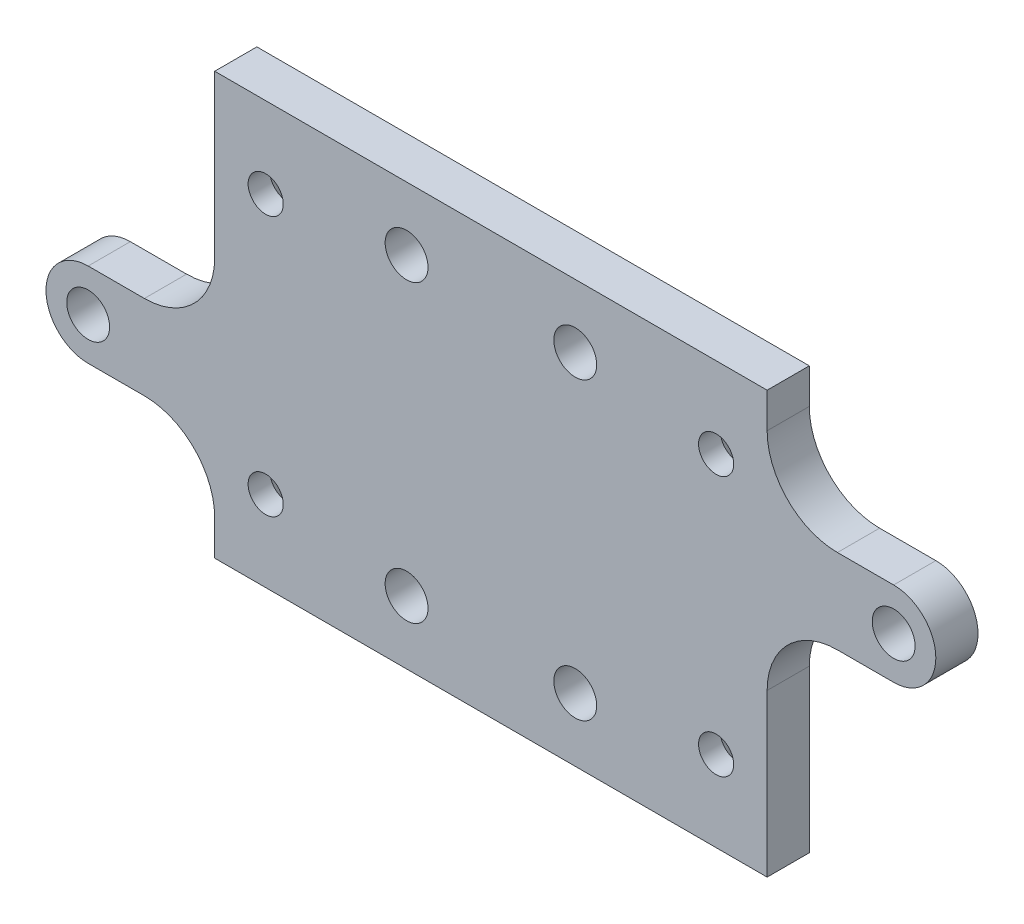
ISO-10303-21;
HEADER;
FILE_DESCRIPTION(('STEP AP214'),'2;1');
FILE_NAME('part.step','',(''),(''),'','','');
FILE_SCHEMA(('AUTOMOTIVE_DESIGN { 1 0 10303 214 1 1 1 1 }'));
ENDSEC;
DATA;
#1=APPLICATION_CONTEXT('core data for automotive mechanical design processes');
#2=APPLICATION_PROTOCOL_DEFINITION('international standard','automotive_design',2000,#1);
#3=PRODUCT_CONTEXT('',#1,'mechanical');
#4=PRODUCT('Part','Part','',(#3));
#5=PRODUCT_RELATED_PRODUCT_CATEGORY('part','',(#4));
#6=PRODUCT_DEFINITION_FORMATION('','',#4);
#7=PRODUCT_DEFINITION_CONTEXT('part definition',#1,'design');
#8=PRODUCT_DEFINITION('design','',#6,#7);
#9=PRODUCT_DEFINITION_SHAPE('','',#8);
#10=(LENGTH_UNIT() NAMED_UNIT(*) SI_UNIT(.MILLI.,.METRE.));
#11=(NAMED_UNIT(*) PLANE_ANGLE_UNIT() SI_UNIT($,.RADIAN.));
#12=(NAMED_UNIT(*) SI_UNIT($,.STERADIAN.) SOLID_ANGLE_UNIT());
#13=UNCERTAINTY_MEASURE_WITH_UNIT(LENGTH_MEASURE(1.E-05),#10,'distance_accuracy_value','');
#14=(GEOMETRIC_REPRESENTATION_CONTEXT(3) GLOBAL_UNCERTAINTY_ASSIGNED_CONTEXT((#13)) GLOBAL_UNIT_ASSIGNED_CONTEXT((#10,
#11,#12)) REPRESENTATION_CONTEXT('',''));
#15=CARTESIAN_POINT('',(0.,0.,0.));
#16=DIRECTION('',(0.,0.,1.));
#17=DIRECTION('',(1.,0.,0.));
#18=AXIS2_PLACEMENT_3D('',#15,#16,#17);
#19=CARTESIAN_POINT('',(19.65,-15.,3.));
#20=DIRECTION('',(-1.,0.,0.));
#21=DIRECTION('',(0.,0.,1.));
#22=AXIS2_PLACEMENT_3D('',#19,#20,#21);
#23=PLANE('',#22);
#24=DIRECTION('',(0.,1.,0.));
#25=VECTOR('',#24,1.);
#26=CARTESIAN_POINT('',(19.65,-15.,3.));
#27=LINE('',#26,#25);
#28=CARTESIAN_POINT('',(19.65,12.5,3.));
#29=VERTEX_POINT('',#28);
#30=CARTESIAN_POINT('',(19.65,15.,3.));
#31=VERTEX_POINT('',#30);
#32=EDGE_CURVE('E214',#29,#31,#27,.T.);
#33=ORIENTED_EDGE('',*,*,#32,.F.);
#34=DIRECTION('',(0.,0.,1.));
#35=VECTOR('',#34,1.);
#36=CARTESIAN_POINT('',(19.65,12.5,3.));
#37=LINE('',#36,#35);
#38=CARTESIAN_POINT('',(19.65,12.5,0.));
#39=VERTEX_POINT('',#38);
#40=EDGE_CURVE('E258',#29,#39,#37,.F.);
#41=ORIENTED_EDGE('',*,*,#40,.T.);
#42=DIRECTION('',(0.,1.,0.));
#43=VECTOR('',#42,1.);
#44=CARTESIAN_POINT('',(19.65,-15.,0.));
#45=LINE('',#44,#43);
#46=CARTESIAN_POINT('',(19.65,15.,0.));
#47=VERTEX_POINT('',#46);
#48=EDGE_CURVE('E199',#39,#47,#45,.T.);
#49=ORIENTED_EDGE('',*,*,#48,.T.);
#50=DIRECTION('',(0.,0.,-1.));
#51=VECTOR('',#50,1.);
#52=CARTESIAN_POINT('',(19.65,15.,3.));
#53=LINE('',#52,#51);
#54=EDGE_CURVE('E242',#31,#47,#53,.T.);
#55=ORIENTED_EDGE('',*,*,#54,.F.);
#56=EDGE_LOOP('',(#33,#41,#49,#55));
#57=FACE_BOUND('',#56,.T.);
#58=ADVANCED_FACE('F35',(#57),#23,.F.);
#59=CARTESIAN_POINT('',(-19.65,-15.,3.));
#60=DIRECTION('',(1.,0.,0.));
#61=DIRECTION('',(0.,0.,-1.));
#62=AXIS2_PLACEMENT_3D('',#59,#60,#61);
#63=PLANE('',#62);
#64=DIRECTION('',(0.,-1.,0.));
#65=VECTOR('',#64,1.);
#66=CARTESIAN_POINT('',(-19.65,-15.,3.));
#67=LINE('',#66,#65);
#68=CARTESIAN_POINT('',(-19.65,-12.5,3.));
#69=VERTEX_POINT('',#68);
#70=CARTESIAN_POINT('',(-19.65,-15.,3.));
#71=VERTEX_POINT('',#70);
#72=EDGE_CURVE('E216',#69,#71,#67,.T.);
#73=ORIENTED_EDGE('',*,*,#72,.F.);
#74=DIRECTION('',(0.,0.,1.));
#75=VECTOR('',#74,1.);
#76=CARTESIAN_POINT('',(-19.65,-12.5,3.));
#77=LINE('',#76,#75);
#78=CARTESIAN_POINT('',(-19.65,-12.5,0.));
#79=VERTEX_POINT('',#78);
#80=EDGE_CURVE('E248',#69,#79,#77,.F.);
#81=ORIENTED_EDGE('',*,*,#80,.T.);
#82=DIRECTION('',(0.,-1.,0.));
#83=VECTOR('',#82,1.);
#84=CARTESIAN_POINT('',(-19.65,-15.,0.));
#85=LINE('',#84,#83);
#86=CARTESIAN_POINT('',(-19.65,-15.,0.));
#87=VERTEX_POINT('',#86);
#88=EDGE_CURVE('E228',#79,#87,#85,.T.);
#89=ORIENTED_EDGE('',*,*,#88,.T.);
#90=DIRECTION('',(0.,0.,-1.));
#91=VECTOR('',#90,1.);
#92=CARTESIAN_POINT('',(-19.65,-15.,3.));
#93=LINE('',#92,#91);
#94=EDGE_CURVE('E236',#71,#87,#93,.T.);
#95=ORIENTED_EDGE('',*,*,#94,.F.);
#96=EDGE_LOOP('',(#73,#81,#89,#95));
#97=FACE_BOUND('',#96,.T.);
#98=ADVANCED_FACE('F329',(#97),#63,.F.);
#99=CARTESIAN_POINT('',(19.65,-15.,0.));
#100=VERTEX_POINT('',#99);
#101=CARTESIAN_POINT('',(19.65,-3.50000000000001,0.));
#102=VERTEX_POINT('',#101);
#103=EDGE_CURVE('E223',#100,#102,#45,.T.);
#104=ORIENTED_EDGE('',*,*,#103,.T.);
#105=DIRECTION('',(0.,0.,1.));
#106=VECTOR('',#105,1.);
#107=CARTESIAN_POINT('',(19.65,-3.5,3.));
#108=LINE('',#107,#106);
#109=CARTESIAN_POINT('',(19.65,-3.50000000000001,3.));
#110=VERTEX_POINT('',#109);
#111=EDGE_CURVE('E260',#102,#110,#108,.T.);
#112=ORIENTED_EDGE('',*,*,#111,.T.);
#113=CARTESIAN_POINT('',(19.65,-15.,3.));
#114=VERTEX_POINT('',#113);
#115=EDGE_CURVE('E211',#114,#110,#27,.T.);
#116=ORIENTED_EDGE('',*,*,#115,.F.);
#117=DIRECTION('',(0.,0.,-1.));
#118=VECTOR('',#117,1.);
#119=CARTESIAN_POINT('',(19.65,-15.,3.));
#120=LINE('',#119,#118);
#121=EDGE_CURVE('E222',#114,#100,#120,.T.);
#122=ORIENTED_EDGE('',*,*,#121,.T.);
#123=EDGE_LOOP('',(#104,#112,#116,#122));
#124=FACE_BOUND('',#123,.T.);
#125=ADVANCED_FACE('F332',(#124),#23,.F.);
#126=CARTESIAN_POINT('',(-19.65,15.,3.));
#127=DIRECTION('',(0.,-1.,0.));
#128=DIRECTION('',(0.,0.,-1.));
#129=AXIS2_PLACEMENT_3D('',#126,#127,#128);
#130=PLANE('',#129);
#131=DIRECTION('',(-1.,0.,0.));
#132=VECTOR('',#131,1.);
#133=CARTESIAN_POINT('',(-19.65,15.,0.));
#134=LINE('',#133,#132);
#135=CARTESIAN_POINT('',(-19.65,15.,0.));
#136=VERTEX_POINT('',#135);
#137=EDGE_CURVE('E226',#47,#136,#134,.T.);
#138=ORIENTED_EDGE('',*,*,#137,.T.);
#139=DIRECTION('',(0.,0.,-1.));
#140=VECTOR('',#139,1.);
#141=CARTESIAN_POINT('',(-19.65,15.,3.));
#142=LINE('',#141,#140);
#143=CARTESIAN_POINT('',(-19.65,15.,3.));
#144=VERTEX_POINT('',#143);
#145=EDGE_CURVE('E239',#144,#136,#142,.T.);
#146=ORIENTED_EDGE('',*,*,#145,.F.);
#147=DIRECTION('',(-1.,0.,0.));
#148=VECTOR('',#147,1.);
#149=CARTESIAN_POINT('',(-19.65,15.,3.));
#150=LINE('',#149,#148);
#151=EDGE_CURVE('E213',#31,#144,#150,.T.);
#152=ORIENTED_EDGE('',*,*,#151,.F.);
#153=ORIENTED_EDGE('',*,*,#54,.T.);
#154=EDGE_LOOP('',(#138,#146,#152,#153));
#155=FACE_BOUND('',#154,.T.);
#156=ADVANCED_FACE('F342',(#155),#130,.F.);
#157=CARTESIAN_POINT('',(-19.65,3.49999999999999,0.));
#158=VERTEX_POINT('',#157);
#159=EDGE_CURVE('E229',#136,#158,#85,.T.);
#160=ORIENTED_EDGE('',*,*,#159,.T.);
#161=DIRECTION('',(0.,0.,1.));
#162=VECTOR('',#161,1.);
#163=CARTESIAN_POINT('',(-19.65,3.5,3.));
#164=LINE('',#163,#162);
#165=CARTESIAN_POINT('',(-19.65,3.49999999999999,3.));
#166=VERTEX_POINT('',#165);
#167=EDGE_CURVE('E250',#158,#166,#164,.T.);
#168=ORIENTED_EDGE('',*,*,#167,.T.);
#169=EDGE_CURVE('E217',#144,#166,#67,.T.);
#170=ORIENTED_EDGE('',*,*,#169,.F.);
#171=ORIENTED_EDGE('',*,*,#145,.T.);
#172=EDGE_LOOP('',(#160,#168,#170,#171));
#173=FACE_BOUND('',#172,.T.);
#174=ADVANCED_FACE('F338',(#173),#63,.F.);
#175=CARTESIAN_POINT('',(-19.65,-15.,3.));
#176=DIRECTION('',(0.,1.,0.));
#177=DIRECTION('',(0.,0.,1.));
#178=AXIS2_PLACEMENT_3D('',#175,#176,#177);
#179=PLANE('',#178);
#180=DIRECTION('',(1.,0.,0.));
#181=VECTOR('',#180,1.);
#182=CARTESIAN_POINT('',(-19.65,-15.,0.));
#183=LINE('',#182,#181);
#184=EDGE_CURVE('E232',#87,#100,#183,.T.);
#185=ORIENTED_EDGE('',*,*,#184,.T.);
#186=ORIENTED_EDGE('',*,*,#121,.F.);
#187=DIRECTION('',(1.,0.,0.));
#188=VECTOR('',#187,1.);
#189=CARTESIAN_POINT('',(-19.65,-15.,3.));
#190=LINE('',#189,#188);
#191=EDGE_CURVE('E220',#71,#114,#190,.T.);
#192=ORIENTED_EDGE('',*,*,#191,.F.);
#193=ORIENTED_EDGE('',*,*,#94,.T.);
#194=EDGE_LOOP('',(#185,#186,#192,#193));
#195=FACE_BOUND('',#194,.T.);
#196=ADVANCED_FACE('F390',(#195),#179,.F.);
#197=CARTESIAN_POINT('',(0.,0.,3.));
#198=DIRECTION('',(0.,0.,-1.));
#199=DIRECTION('',(-1.,0.,0.));
#200=AXIS2_PLACEMENT_3D('',#197,#198,#199);
#201=PLANE('',#200);
#202=CARTESIAN_POINT('',(16.0214699700121,9.25000000000011,3.));
#203=DIRECTION('',(0.,0.,-1.));
#204=DIRECTION('',(-1.,0.,0.));
#205=AXIS2_PLACEMENT_3D('',#202,#203,#204);
#206=CIRCLE('',#205,1.25);
#207=CARTESIAN_POINT('',(14.7714699700121,9.25000000000011,3.));
#208=VERTEX_POINT('',#207);
#209=EDGE_CURVE('E636',#208,#208,#206,.T.);
#210=ORIENTED_EDGE('',*,*,#209,.T.);
#211=EDGE_LOOP('',(#210));
#212=FACE_BOUND('',#211,.T.);
#213=CARTESIAN_POINT('',(-16.0214699700121,-9.2500000000001,3.));
#214=DIRECTION('',(0.,0.,-1.));
#215=DIRECTION('',(-1.,0.,0.));
#216=AXIS2_PLACEMENT_3D('',#213,#214,#215);
#217=CIRCLE('',#216,1.25);
#218=CARTESIAN_POINT('',(-17.2714699700121,-9.2500000000001,3.));
#219=VERTEX_POINT('',#218);
#220=EDGE_CURVE('E633',#219,#219,#217,.T.);
#221=ORIENTED_EDGE('',*,*,#220,.T.);
#222=EDGE_LOOP('',(#221));
#223=FACE_BOUND('',#222,.T.);
#224=CARTESIAN_POINT('',(16.0214699700122,-9.2499999999999,3.));
#225=DIRECTION('',(0.,0.,-1.));
#226=DIRECTION('',(-1.,0.,0.));
#227=AXIS2_PLACEMENT_3D('',#224,#225,#226);
#228=CIRCLE('',#227,1.25);
#229=CARTESIAN_POINT('',(14.7714699700122,-9.2499999999999,3.));
#230=VERTEX_POINT('',#229);
#231=EDGE_CURVE('E630',#230,#230,#228,.T.);
#232=ORIENTED_EDGE('',*,*,#231,.T.);
#233=EDGE_LOOP('',(#232));
#234=FACE_BOUND('',#233,.T.);
#235=CARTESIAN_POINT('',(-16.0214699700122,9.2499999999999,3.));
#236=DIRECTION('',(0.,0.,-1.));
#237=DIRECTION('',(-1.,0.,0.));
#238=AXIS2_PLACEMENT_3D('',#235,#236,#237);
#239=CIRCLE('',#238,1.25);
#240=CARTESIAN_POINT('',(-17.2714699700122,9.2499999999999,3.));
#241=VERTEX_POINT('',#240);
#242=EDGE_CURVE('E627',#241,#241,#239,.T.);
#243=ORIENTED_EDGE('',*,*,#242,.T.);
#244=EDGE_LOOP('',(#243));
#245=FACE_BOUND('',#244,.T.);
#246=CARTESIAN_POINT('',(6.,-10.5,3.));
#247=DIRECTION('',(0.,0.,1.));
#248=DIRECTION('',(1.,0.,0.));
#249=AXIS2_PLACEMENT_3D('',#246,#247,#248);
#250=CIRCLE('',#249,1.525);
#251=CARTESIAN_POINT('',(7.525,-10.5,3.));
#252=VERTEX_POINT('',#251);
#253=EDGE_CURVE('E639',#252,#252,#250,.T.);
#254=ORIENTED_EDGE('',*,*,#253,.F.);
#255=EDGE_LOOP('',(#254));
#256=FACE_BOUND('',#255,.T.);
#257=CARTESIAN_POINT('',(-6.,-10.5,3.));
#258=DIRECTION('',(0.,0.,1.));
#259=DIRECTION('',(1.,0.,0.));
#260=AXIS2_PLACEMENT_3D('',#257,#258,#259);
#261=CIRCLE('',#260,1.525);
#262=CARTESIAN_POINT('',(-4.475,-10.5,3.));
#263=VERTEX_POINT('',#262);
#264=EDGE_CURVE('E643',#263,#263,#261,.T.);
#265=ORIENTED_EDGE('',*,*,#264,.F.);
#266=EDGE_LOOP('',(#265));
#267=FACE_BOUND('',#266,.T.);
#268=CARTESIAN_POINT('',(-6.,10.5,3.));
#269=DIRECTION('',(0.,0.,1.));
#270=DIRECTION('',(1.,0.,0.));
#271=AXIS2_PLACEMENT_3D('',#268,#269,#270);
#272=CIRCLE('',#271,1.525);
#273=CARTESIAN_POINT('',(-4.475,10.5,3.));
#274=VERTEX_POINT('',#273);
#275=EDGE_CURVE('E640',#274,#274,#272,.T.);
#276=ORIENTED_EDGE('',*,*,#275,.F.);
#277=EDGE_LOOP('',(#276));
#278=FACE_BOUND('',#277,.T.);
#279=CARTESIAN_POINT('',(6.,10.5,3.));
#280=DIRECTION('',(0.,0.,1.));
#281=DIRECTION('',(1.,0.,0.));
#282=AXIS2_PLACEMENT_3D('',#279,#280,#281);
#283=CIRCLE('',#282,1.525);
#284=CARTESIAN_POINT('',(7.525,10.5,3.));
#285=VERTEX_POINT('',#284);
#286=EDGE_CURVE('E281',#285,#285,#283,.T.);
#287=ORIENTED_EDGE('',*,*,#286,.F.);
#288=EDGE_LOOP('',(#287));
#289=FACE_BOUND('',#288,.T.);
#290=ORIENTED_EDGE('',*,*,#115,.T.);
#291=CARTESIAN_POINT('',(24.65,-3.5,3.));
#292=DIRECTION('',(0.,0.,-1.));
#293=DIRECTION('',(-1.,0.,0.));
#294=AXIS2_PLACEMENT_3D('',#291,#292,#293);
#295=CIRCLE('',#294,5.);
#296=CARTESIAN_POINT('',(24.65,1.5,3.));
#297=VERTEX_POINT('',#296);
#298=EDGE_CURVE('E44',#110,#297,#295,.T.);
#299=ORIENTED_EDGE('',*,*,#298,.T.);
#300=DIRECTION('',(1.,0.,0.));
#301=VECTOR('',#300,1.);
#302=CARTESIAN_POINT('',(19.65,1.5,3.));
#303=LINE('',#302,#301);
#304=CARTESIAN_POINT('',(28.65,1.5,3.));
#305=VERTEX_POINT('',#304);
#306=EDGE_CURVE('E146',#297,#305,#303,.T.);
#307=ORIENTED_EDGE('',*,*,#306,.T.);
#308=CARTESIAN_POINT('',(28.65,4.5,3.));
#309=DIRECTION('',(0.,0.,1.));
#310=DIRECTION('',(1.,0.,0.));
#311=AXIS2_PLACEMENT_3D('',#308,#309,#310);
#312=CIRCLE('',#311,3.);
#313=CARTESIAN_POINT('',(28.65,7.5,3.));
#314=VERTEX_POINT('',#313);
#315=EDGE_CURVE('E152',#305,#314,#312,.T.);
#316=ORIENTED_EDGE('',*,*,#315,.T.);
#317=DIRECTION('',(-1.,0.,0.));
#318=VECTOR('',#317,1.);
#319=CARTESIAN_POINT('',(28.65,7.5,3.));
#320=LINE('',#319,#318);
#321=CARTESIAN_POINT('',(24.65,7.5,3.));
#322=VERTEX_POINT('',#321);
#323=EDGE_CURVE('E154',#314,#322,#320,.T.);
#324=ORIENTED_EDGE('',*,*,#323,.T.);
#325=CARTESIAN_POINT('',(24.65,12.5,3.));
#326=DIRECTION('',(0.,0.,-1.));
#327=DIRECTION('',(-1.,0.,0.));
#328=AXIS2_PLACEMENT_3D('',#325,#326,#327);
#329=CIRCLE('',#328,5.);
#330=EDGE_CURVE('E272',#322,#29,#329,.T.);
#331=ORIENTED_EDGE('',*,*,#330,.T.);
#332=ORIENTED_EDGE('',*,*,#32,.T.);
#333=ORIENTED_EDGE('',*,*,#151,.T.);
#334=ORIENTED_EDGE('',*,*,#169,.T.);
#335=CARTESIAN_POINT('',(-24.65,3.5,3.));
#336=DIRECTION('',(0.,0.,-1.));
#337=DIRECTION('',(-1.,0.,0.));
#338=AXIS2_PLACEMENT_3D('',#335,#336,#337);
#339=CIRCLE('',#338,5.);
#340=CARTESIAN_POINT('',(-24.65,-1.5,3.));
#341=VERTEX_POINT('',#340);
#342=EDGE_CURVE('E268',#166,#341,#339,.T.);
#343=ORIENTED_EDGE('',*,*,#342,.T.);
#344=DIRECTION('',(-1.,0.,0.));
#345=VECTOR('',#344,1.);
#346=CARTESIAN_POINT('',(-19.65,-1.5,3.));
#347=LINE('',#346,#345);
#348=CARTESIAN_POINT('',(-28.65,-1.5,3.));
#349=VERTEX_POINT('',#348);
#350=EDGE_CURVE('E184',#341,#349,#347,.T.);
#351=ORIENTED_EDGE('',*,*,#350,.T.);
#352=CARTESIAN_POINT('',(-28.65,-4.5,3.));
#353=DIRECTION('',(0.,0.,1.));
#354=DIRECTION('',(1.,0.,0.));
#355=AXIS2_PLACEMENT_3D('',#352,#353,#354);
#356=CIRCLE('',#355,3.);
#357=CARTESIAN_POINT('',(-28.65,-7.5,3.));
#358=VERTEX_POINT('',#357);
#359=EDGE_CURVE('E190',#349,#358,#356,.T.);
#360=ORIENTED_EDGE('',*,*,#359,.T.);
#361=DIRECTION('',(1.,0.,0.));
#362=VECTOR('',#361,1.);
#363=CARTESIAN_POINT('',(-28.65,-7.5,3.));
#364=LINE('',#363,#362);
#365=CARTESIAN_POINT('',(-24.65,-7.5,3.));
#366=VERTEX_POINT('',#365);
#367=EDGE_CURVE('E187',#358,#366,#364,.T.);
#368=ORIENTED_EDGE('',*,*,#367,.T.);
#369=CARTESIAN_POINT('',(-24.65,-12.5,3.));
#370=DIRECTION('',(0.,0.,-1.));
#371=DIRECTION('',(-1.,0.,0.));
#372=AXIS2_PLACEMENT_3D('',#369,#370,#371);
#373=CIRCLE('',#372,5.);
#374=EDGE_CURVE('E264',#366,#69,#373,.T.);
#375=ORIENTED_EDGE('',*,*,#374,.T.);
#376=ORIENTED_EDGE('',*,*,#72,.T.);
#377=ORIENTED_EDGE('',*,*,#191,.T.);
#378=EDGE_LOOP('',(#290,#299,#307,#316,#324,#331,#332,#333,#334,#343,#351,#360,#368,#375,#376,#377));
#379=FACE_BOUND('',#378,.T.);
#380=CARTESIAN_POINT('',(-28.65,-4.5,3.));
#381=DIRECTION('',(0.,0.,1.));
#382=DIRECTION('',(1.,0.,0.));
#383=AXIS2_PLACEMENT_3D('',#380,#381,#382);
#384=CIRCLE('',#383,1.525);
#385=CARTESIAN_POINT('',(-27.125,-4.5,3.));
#386=VERTEX_POINT('',#385);
#387=EDGE_CURVE('E193',#386,#386,#384,.T.);
#388=ORIENTED_EDGE('',*,*,#387,.F.);
#389=EDGE_LOOP('',(#388));
#390=FACE_BOUND('',#389,.T.);
#391=CARTESIAN_POINT('',(28.65,4.5,3.));
#392=DIRECTION('',(0.,0.,1.));
#393=DIRECTION('',(1.,0.,0.));
#394=AXIS2_PLACEMENT_3D('',#391,#392,#393);
#395=CIRCLE('',#394,1.525);
#396=CARTESIAN_POINT('',(30.175,4.5,3.));
#397=VERTEX_POINT('',#396);
#398=EDGE_CURVE('E169',#397,#397,#395,.T.);
#399=ORIENTED_EDGE('',*,*,#398,.F.);
#400=EDGE_LOOP('',(#399));
#401=FACE_BOUND('',#400,.T.);
#402=ADVANCED_FACE('F148',(#212,#223,#234,#245,#256,#267,#278,#289,#379,#390,#401),#201,.F.);
#403=CARTESIAN_POINT('',(0.,0.,0.));
#404=DIRECTION('',(0.,0.,-1.));
#405=DIRECTION('',(-1.,0.,0.));
#406=AXIS2_PLACEMENT_3D('',#403,#404,#405);
#407=PLANE('',#406);
#408=CARTESIAN_POINT('',(16.0214699700121,9.25000000000011,0.));
#409=DIRECTION('',(0.,0.,-1.));
#410=DIRECTION('',(-1.,0.,0.));
#411=AXIS2_PLACEMENT_3D('',#408,#409,#410);
#412=CIRCLE('',#411,2.7);
#413=CARTESIAN_POINT('',(13.3214699700121,9.25000000000011,0.));
#414=VERTEX_POINT('',#413);
#415=EDGE_CURVE('E605',#414,#414,#412,.T.);
#416=ORIENTED_EDGE('',*,*,#415,.F.);
#417=EDGE_LOOP('',(#416));
#418=FACE_BOUND('',#417,.T.);
#419=CARTESIAN_POINT('',(16.0214699700122,-9.2499999999999,0.));
#420=DIRECTION('',(0.,0.,-1.));
#421=DIRECTION('',(-1.,0.,0.));
#422=AXIS2_PLACEMENT_3D('',#419,#420,#421);
#423=CIRCLE('',#422,2.7);
#424=CARTESIAN_POINT('',(13.3214699700122,-9.2499999999999,0.));
#425=VERTEX_POINT('',#424);
#426=EDGE_CURVE('E607',#425,#425,#423,.T.);
#427=ORIENTED_EDGE('',*,*,#426,.F.);
#428=EDGE_LOOP('',(#427));
#429=FACE_BOUND('',#428,.T.);
#430=CARTESIAN_POINT('',(-16.0214699700122,9.2499999999999,0.));
#431=DIRECTION('',(0.,0.,-1.));
#432=DIRECTION('',(-1.,0.,0.));
#433=AXIS2_PLACEMENT_3D('',#430,#431,#432);
#434=CIRCLE('',#433,2.7);
#435=CARTESIAN_POINT('',(-18.7214699700122,9.2499999999999,0.));
#436=VERTEX_POINT('',#435);
#437=EDGE_CURVE('E615',#436,#436,#434,.T.);
#438=ORIENTED_EDGE('',*,*,#437,.F.);
#439=EDGE_LOOP('',(#438));
#440=FACE_BOUND('',#439,.T.);
#441=CARTESIAN_POINT('',(-16.0214699700121,-9.2500000000001,0.));
#442=DIRECTION('',(0.,0.,-1.));
#443=DIRECTION('',(-1.,0.,0.));
#444=AXIS2_PLACEMENT_3D('',#441,#442,#443);
#445=CIRCLE('',#444,2.7);
#446=CARTESIAN_POINT('',(-18.7214699700121,-9.2500000000001,0.));
#447=VERTEX_POINT('',#446);
#448=EDGE_CURVE('E621',#447,#447,#445,.T.);
#449=ORIENTED_EDGE('',*,*,#448,.F.);
#450=EDGE_LOOP('',(#449));
#451=FACE_BOUND('',#450,.T.);
#452=CARTESIAN_POINT('',(6.,-10.5,0.));
#453=DIRECTION('',(0.,0.,-1.));
#454=DIRECTION('',(-1.,0.,0.));
#455=AXIS2_PLACEMENT_3D('',#452,#453,#454);
#456=CIRCLE('',#455,1.525);
#457=CARTESIAN_POINT('',(4.475,-10.5,0.));
#458=VERTEX_POINT('',#457);
#459=EDGE_CURVE('E39',#458,#458,#456,.T.);
#460=ORIENTED_EDGE('',*,*,#459,.F.);
#461=EDGE_LOOP('',(#460));
#462=FACE_BOUND('',#461,.T.);
#463=CARTESIAN_POINT('',(-6.,-10.5,0.));
#464=DIRECTION('',(0.,0.,-1.));
#465=DIRECTION('',(-1.,0.,0.));
#466=AXIS2_PLACEMENT_3D('',#463,#464,#465);
#467=CIRCLE('',#466,1.525);
#468=CARTESIAN_POINT('',(-7.525,-10.5,0.));
#469=VERTEX_POINT('',#468);
#470=EDGE_CURVE('E283',#469,#469,#467,.T.);
#471=ORIENTED_EDGE('',*,*,#470,.F.);
#472=EDGE_LOOP('',(#471));
#473=FACE_BOUND('',#472,.T.);
#474=CARTESIAN_POINT('',(-6.,10.5,0.));
#475=DIRECTION('',(0.,0.,-1.));
#476=DIRECTION('',(-1.,0.,0.));
#477=AXIS2_PLACEMENT_3D('',#474,#475,#476);
#478=CIRCLE('',#477,1.525);
#479=CARTESIAN_POINT('',(-7.525,10.5,0.));
#480=VERTEX_POINT('',#479);
#481=EDGE_CURVE('E280',#480,#480,#478,.T.);
#482=ORIENTED_EDGE('',*,*,#481,.F.);
#483=EDGE_LOOP('',(#482));
#484=FACE_BOUND('',#483,.T.);
#485=CARTESIAN_POINT('',(6.,10.5,0.));
#486=DIRECTION('',(0.,0.,-1.));
#487=DIRECTION('',(-1.,0.,0.));
#488=AXIS2_PLACEMENT_3D('',#485,#486,#487);
#489=CIRCLE('',#488,1.525);
#490=CARTESIAN_POINT('',(4.475,10.5,0.));
#491=VERTEX_POINT('',#490);
#492=EDGE_CURVE('E277',#491,#491,#489,.T.);
#493=ORIENTED_EDGE('',*,*,#492,.F.);
#494=EDGE_LOOP('',(#493));
#495=FACE_BOUND('',#494,.T.);
#496=ORIENTED_EDGE('',*,*,#103,.F.);
#497=ORIENTED_EDGE('',*,*,#184,.F.);
#498=ORIENTED_EDGE('',*,*,#88,.F.);
#499=CARTESIAN_POINT('',(-24.65,-12.5,0.));
#500=DIRECTION('',(0.,0.,-1.));
#501=DIRECTION('',(-1.,0.,0.));
#502=AXIS2_PLACEMENT_3D('',#499,#500,#501);
#503=CIRCLE('',#502,5.);
#504=CARTESIAN_POINT('',(-24.65,-7.5,0.));
#505=VERTEX_POINT('',#504);
#506=EDGE_CURVE('E266',#79,#505,#503,.F.);
#507=ORIENTED_EDGE('',*,*,#506,.T.);
#508=DIRECTION('',(1.,0.,0.));
#509=VECTOR('',#508,1.);
#510=CARTESIAN_POINT('',(-28.65,-7.5,0.));
#511=LINE('',#510,#509);
#512=CARTESIAN_POINT('',(-28.65,-7.5,0.));
#513=VERTEX_POINT('',#512);
#514=EDGE_CURVE('E196',#513,#505,#511,.T.);
#515=ORIENTED_EDGE('',*,*,#514,.F.);
#516=CARTESIAN_POINT('',(-28.65,-4.5,0.));
#517=DIRECTION('',(0.,0.,-1.));
#518=DIRECTION('',(-1.,0.,0.));
#519=AXIS2_PLACEMENT_3D('',#516,#517,#518);
#520=CIRCLE('',#519,3.);
#521=CARTESIAN_POINT('',(-28.65,-1.5,0.));
#522=VERTEX_POINT('',#521);
#523=EDGE_CURVE('E177',#522,#513,#520,.F.);
#524=ORIENTED_EDGE('',*,*,#523,.F.);
#525=DIRECTION('',(-1.,0.,0.));
#526=VECTOR('',#525,1.);
#527=CARTESIAN_POINT('',(-19.65,-1.5,0.));
#528=LINE('',#527,#526);
#529=CARTESIAN_POINT('',(-24.65,-1.5,0.));
#530=VERTEX_POINT('',#529);
#531=EDGE_CURVE('E206',#530,#522,#528,.T.);
#532=ORIENTED_EDGE('',*,*,#531,.F.);
#533=CARTESIAN_POINT('',(-24.65,3.5,0.));
#534=DIRECTION('',(0.,0.,-1.));
#535=DIRECTION('',(-1.,0.,0.));
#536=AXIS2_PLACEMENT_3D('',#533,#534,#535);
#537=CIRCLE('',#536,5.);
#538=EDGE_CURVE('E270',#530,#158,#537,.F.);
#539=ORIENTED_EDGE('',*,*,#538,.T.);
#540=ORIENTED_EDGE('',*,*,#159,.F.);
#541=ORIENTED_EDGE('',*,*,#137,.F.);
#542=ORIENTED_EDGE('',*,*,#48,.F.);
#543=CARTESIAN_POINT('',(24.65,12.5,0.));
#544=DIRECTION('',(0.,0.,-1.));
#545=DIRECTION('',(-1.,0.,0.));
#546=AXIS2_PLACEMENT_3D('',#543,#544,#545);
#547=CIRCLE('',#546,5.);
#548=CARTESIAN_POINT('',(24.65,7.5,0.));
#549=VERTEX_POINT('',#548);
#550=EDGE_CURVE('E274',#39,#549,#547,.F.);
#551=ORIENTED_EDGE('',*,*,#550,.T.);
#552=DIRECTION('',(-1.,0.,0.));
#553=VECTOR('',#552,1.);
#554=CARTESIAN_POINT('',(28.65,7.5,0.));
#555=LINE('',#554,#553);
#556=CARTESIAN_POINT('',(28.65,7.5,0.));
#557=VERTEX_POINT('',#556);
#558=EDGE_CURVE('E163',#557,#549,#555,.T.);
#559=ORIENTED_EDGE('',*,*,#558,.F.);
#560=CARTESIAN_POINT('',(28.65,4.5,0.));
#561=DIRECTION('',(0.,0.,-1.));
#562=DIRECTION('',(-1.,0.,0.));
#563=AXIS2_PLACEMENT_3D('',#560,#561,#562);
#564=CIRCLE('',#563,3.);
#565=CARTESIAN_POINT('',(28.65,1.5,0.));
#566=VERTEX_POINT('',#565);
#567=EDGE_CURVE('E180',#566,#557,#564,.F.);
#568=ORIENTED_EDGE('',*,*,#567,.F.);
#569=DIRECTION('',(1.,0.,0.));
#570=VECTOR('',#569,1.);
#571=CARTESIAN_POINT('',(19.65,1.5,0.));
#572=LINE('',#571,#570);
#573=CARTESIAN_POINT('',(24.65,1.5,0.));
#574=VERTEX_POINT('',#573);
#575=EDGE_CURVE('E159',#574,#566,#572,.T.);
#576=ORIENTED_EDGE('',*,*,#575,.F.);
#577=CARTESIAN_POINT('',(24.65,-3.5,0.));
#578=DIRECTION('',(0.,0.,-1.));
#579=DIRECTION('',(-1.,0.,0.));
#580=AXIS2_PLACEMENT_3D('',#577,#578,#579);
#581=CIRCLE('',#580,5.);
#582=EDGE_CURVE('E11',#574,#102,#581,.F.);
#583=ORIENTED_EDGE('',*,*,#582,.T.);
#584=EDGE_LOOP('',(#496,#497,#498,#507,#515,#524,#532,#539,#540,#541,#542,#551,#559,#568,#576,#583));
#585=FACE_BOUND('',#584,.T.);
#586=CARTESIAN_POINT('',(-28.65,-4.5,0.));
#587=DIRECTION('',(0.,0.,-1.));
#588=DIRECTION('',(-1.,0.,0.));
#589=AXIS2_PLACEMENT_3D('',#586,#587,#588);
#590=CIRCLE('',#589,1.525);
#591=CARTESIAN_POINT('',(-30.175,-4.5,0.));
#592=VERTEX_POINT('',#591);
#593=EDGE_CURVE('E186',#592,#592,#590,.F.);
#594=ORIENTED_EDGE('',*,*,#593,.T.);
#595=EDGE_LOOP('',(#594));
#596=FACE_BOUND('',#595,.T.);
#597=CARTESIAN_POINT('',(28.65,4.5,0.));
#598=DIRECTION('',(0.,0.,-1.));
#599=DIRECTION('',(-1.,0.,0.));
#600=AXIS2_PLACEMENT_3D('',#597,#598,#599);
#601=CIRCLE('',#600,1.525);
#602=CARTESIAN_POINT('',(27.125,4.5,0.));
#603=VERTEX_POINT('',#602);
#604=EDGE_CURVE('E153',#603,#603,#601,.F.);
#605=ORIENTED_EDGE('',*,*,#604,.T.);
#606=EDGE_LOOP('',(#605));
#607=FACE_BOUND('',#606,.T.);
#608=ADVANCED_FACE('F293',(#418,#429,#440,#451,#462,#473,#484,#495,#585,#596,#607),#407,.T.);
#609=CARTESIAN_POINT('',(-28.65,-4.5,-13.4164078649987));
#610=DIRECTION('',(0.,0.,1.));
#611=DIRECTION('',(1.,0.,0.));
#612=AXIS2_PLACEMENT_3D('',#609,#610,#611);
#613=CYLINDRICAL_SURFACE('',#612,3.);
#614=DIRECTION('',(0.,0.,1.));
#615=VECTOR('',#614,1.);
#616=CARTESIAN_POINT('',(-28.65,-1.5,-13.4164078649987));
#617=LINE('',#616,#615);
#618=EDGE_CURVE('E202',#522,#349,#617,.T.);
#619=ORIENTED_EDGE('',*,*,#618,.F.);
#620=ORIENTED_EDGE('',*,*,#523,.T.);
#621=DIRECTION('',(0.,0.,1.));
#622=VECTOR('',#621,1.);
#623=CARTESIAN_POINT('',(-28.65,-7.5,-13.4164078649987));
#624=LINE('',#623,#622);
#625=EDGE_CURVE('E205',#513,#358,#624,.T.);
#626=ORIENTED_EDGE('',*,*,#625,.T.);
#627=ORIENTED_EDGE('',*,*,#359,.F.);
#628=EDGE_LOOP('',(#619,#620,#626,#627));
#629=FACE_BOUND('',#628,.T.);
#630=ADVANCED_FACE('F296',(#629),#613,.T.);
#631=CARTESIAN_POINT('',(-19.65,-1.5,-13.4164078649987));
#632=DIRECTION('',(0.,1.,0.));
#633=DIRECTION('',(-1.,0.,0.));
#634=AXIS2_PLACEMENT_3D('',#631,#632,#633);
#635=PLANE('',#634);
#636=ORIENTED_EDGE('',*,*,#350,.F.);
#637=DIRECTION('',(0.,0.,1.));
#638=VECTOR('',#637,1.);
#639=CARTESIAN_POINT('',(-24.65,-1.5,-13.4164078649987));
#640=LINE('',#639,#638);
#641=EDGE_CURVE('E253',#341,#530,#640,.F.);
#642=ORIENTED_EDGE('',*,*,#641,.T.);
#643=ORIENTED_EDGE('',*,*,#531,.T.);
#644=ORIENTED_EDGE('',*,*,#618,.T.);
#645=EDGE_LOOP('',(#636,#642,#643,#644));
#646=FACE_BOUND('',#645,.T.);
#647=ADVANCED_FACE('F374',(#646),#635,.T.);
#648=CARTESIAN_POINT('',(-28.65,-7.5,-13.4164078649987));
#649=DIRECTION('',(0.,-1.,0.));
#650=DIRECTION('',(0.,0.,-1.));
#651=AXIS2_PLACEMENT_3D('',#648,#649,#650);
#652=PLANE('',#651);
#653=ORIENTED_EDGE('',*,*,#514,.T.);
#654=DIRECTION('',(0.,0.,1.));
#655=VECTOR('',#654,1.);
#656=CARTESIAN_POINT('',(-24.65,-7.5,-13.4164078649987));
#657=LINE('',#656,#655);
#658=EDGE_CURVE('E245',#505,#366,#657,.T.);
#659=ORIENTED_EDGE('',*,*,#658,.T.);
#660=ORIENTED_EDGE('',*,*,#367,.F.);
#661=ORIENTED_EDGE('',*,*,#625,.F.);
#662=EDGE_LOOP('',(#653,#659,#660,#661));
#663=FACE_BOUND('',#662,.T.);
#664=ADVANCED_FACE('F383',(#663),#652,.T.);
#665=CARTESIAN_POINT('',(-28.65,-4.5,-13.4164078649987));
#666=DIRECTION('',(0.,0.,1.));
#667=DIRECTION('',(1.,0.,0.));
#668=AXIS2_PLACEMENT_3D('',#665,#666,#667);
#669=CYLINDRICAL_SURFACE('',#668,1.525);
#670=ORIENTED_EDGE('',*,*,#387,.T.);
#671=EDGE_LOOP('',(#670));
#672=FACE_BOUND('',#671,.T.);
#673=ORIENTED_EDGE('',*,*,#593,.F.);
#674=EDGE_LOOP('',(#673));
#675=FACE_BOUND('',#674,.T.);
#676=ADVANCED_FACE('F402',(#672,#675),#669,.F.);
#677=CARTESIAN_POINT('',(28.65,4.5,-13.4164078649987));
#678=DIRECTION('',(0.,0.,1.));
#679=DIRECTION('',(1.,0.,0.));
#680=AXIS2_PLACEMENT_3D('',#677,#678,#679);
#681=CYLINDRICAL_SURFACE('',#680,3.);
#682=DIRECTION('',(0.,0.,1.));
#683=VECTOR('',#682,1.);
#684=CARTESIAN_POINT('',(28.65,1.5,-13.4164078649987));
#685=LINE('',#684,#683);
#686=EDGE_CURVE('E157',#566,#305,#685,.T.);
#687=ORIENTED_EDGE('',*,*,#686,.F.);
#688=ORIENTED_EDGE('',*,*,#567,.T.);
#689=DIRECTION('',(0.,0.,1.));
#690=VECTOR('',#689,1.);
#691=CARTESIAN_POINT('',(28.65,7.5,-13.4164078649987));
#692=LINE('',#691,#690);
#693=EDGE_CURVE('E167',#557,#314,#692,.T.);
#694=ORIENTED_EDGE('',*,*,#693,.T.);
#695=ORIENTED_EDGE('',*,*,#315,.F.);
#696=EDGE_LOOP('',(#687,#688,#694,#695));
#697=FACE_BOUND('',#696,.T.);
#698=ADVANCED_FACE('F165',(#697),#681,.T.);
#699=CARTESIAN_POINT('',(19.65,1.5,-13.4164078649987));
#700=DIRECTION('',(0.,-1.,0.));
#701=DIRECTION('',(1.,0.,0.));
#702=AXIS2_PLACEMENT_3D('',#699,#700,#701);
#703=PLANE('',#702);
#704=ORIENTED_EDGE('',*,*,#306,.F.);
#705=DIRECTION('',(0.,0.,1.));
#706=VECTOR('',#705,1.);
#707=CARTESIAN_POINT('',(24.65,1.5,-13.4164078649987));
#708=LINE('',#707,#706);
#709=EDGE_CURVE('E58',#297,#574,#708,.F.);
#710=ORIENTED_EDGE('',*,*,#709,.T.);
#711=ORIENTED_EDGE('',*,*,#575,.T.);
#712=ORIENTED_EDGE('',*,*,#686,.T.);
#713=EDGE_LOOP('',(#704,#710,#711,#712));
#714=FACE_BOUND('',#713,.T.);
#715=ADVANCED_FACE('F158',(#714),#703,.T.);
#716=CARTESIAN_POINT('',(28.65,7.5,-13.4164078649987));
#717=DIRECTION('',(0.,1.,0.));
#718=DIRECTION('',(0.,0.,1.));
#719=AXIS2_PLACEMENT_3D('',#716,#717,#718);
#720=PLANE('',#719);
#721=ORIENTED_EDGE('',*,*,#558,.T.);
#722=DIRECTION('',(0.,0.,1.));
#723=VECTOR('',#722,1.);
#724=CARTESIAN_POINT('',(24.65,7.5,-13.4164078649987));
#725=LINE('',#724,#723);
#726=EDGE_CURVE('E255',#549,#322,#725,.T.);
#727=ORIENTED_EDGE('',*,*,#726,.T.);
#728=ORIENTED_EDGE('',*,*,#323,.F.);
#729=ORIENTED_EDGE('',*,*,#693,.F.);
#730=EDGE_LOOP('',(#721,#727,#728,#729));
#731=FACE_BOUND('',#730,.T.);
#732=ADVANCED_FACE('F314',(#731),#720,.T.);
#733=CARTESIAN_POINT('',(28.65,4.5,-13.4164078649987));
#734=DIRECTION('',(0.,0.,1.));
#735=DIRECTION('',(1.,0.,0.));
#736=AXIS2_PLACEMENT_3D('',#733,#734,#735);
#737=CYLINDRICAL_SURFACE('',#736,1.525);
#738=ORIENTED_EDGE('',*,*,#398,.T.);
#739=EDGE_LOOP('',(#738));
#740=FACE_BOUND('',#739,.T.);
#741=ORIENTED_EDGE('',*,*,#604,.F.);
#742=EDGE_LOOP('',(#741));
#743=FACE_BOUND('',#742,.T.);
#744=ADVANCED_FACE('F311',(#740,#743),#737,.F.);
#745=CARTESIAN_POINT('',(-24.65,-12.5,-13.4164078649987));
#746=DIRECTION('',(0.,0.,1.));
#747=DIRECTION('',(1.,0.,0.));
#748=AXIS2_PLACEMENT_3D('',#745,#746,#747);
#749=CYLINDRICAL_SURFACE('',#748,5.);
#750=ORIENTED_EDGE('',*,*,#506,.F.);
#751=ORIENTED_EDGE('',*,*,#80,.F.);
#752=ORIENTED_EDGE('',*,*,#374,.F.);
#753=ORIENTED_EDGE('',*,*,#658,.F.);
#754=EDGE_LOOP('',(#750,#751,#752,#753));
#755=FACE_BOUND('',#754,.T.);
#756=ADVANCED_FACE('F313',(#755),#749,.F.);
#757=CARTESIAN_POINT('',(-24.65,3.5,3.));
#758=DIRECTION('',(0.,0.,1.));
#759=DIRECTION('',(1.,0.,0.));
#760=AXIS2_PLACEMENT_3D('',#757,#758,#759);
#761=CYLINDRICAL_SURFACE('',#760,5.);
#762=ORIENTED_EDGE('',*,*,#538,.F.);
#763=ORIENTED_EDGE('',*,*,#641,.F.);
#764=ORIENTED_EDGE('',*,*,#342,.F.);
#765=ORIENTED_EDGE('',*,*,#167,.F.);
#766=EDGE_LOOP('',(#762,#763,#764,#765));
#767=FACE_BOUND('',#766,.T.);
#768=ADVANCED_FACE('F321',(#767),#761,.F.);
#769=CARTESIAN_POINT('',(24.65,12.5,-13.4164078649987));
#770=DIRECTION('',(0.,0.,1.));
#771=DIRECTION('',(1.,0.,0.));
#772=AXIS2_PLACEMENT_3D('',#769,#770,#771);
#773=CYLINDRICAL_SURFACE('',#772,5.);
#774=ORIENTED_EDGE('',*,*,#550,.F.);
#775=ORIENTED_EDGE('',*,*,#40,.F.);
#776=ORIENTED_EDGE('',*,*,#330,.F.);
#777=ORIENTED_EDGE('',*,*,#726,.F.);
#778=EDGE_LOOP('',(#774,#775,#776,#777));
#779=FACE_BOUND('',#778,.T.);
#780=ADVANCED_FACE('F361',(#779),#773,.F.);
#781=CARTESIAN_POINT('',(24.65,-3.5,3.));
#782=DIRECTION('',(0.,0.,1.));
#783=DIRECTION('',(1.,0.,0.));
#784=AXIS2_PLACEMENT_3D('',#781,#782,#783);
#785=CYLINDRICAL_SURFACE('',#784,5.);
#786=ORIENTED_EDGE('',*,*,#582,.F.);
#787=ORIENTED_EDGE('',*,*,#709,.F.);
#788=ORIENTED_EDGE('',*,*,#298,.F.);
#789=ORIENTED_EDGE('',*,*,#111,.F.);
#790=EDGE_LOOP('',(#786,#787,#788,#789));
#791=FACE_BOUND('',#790,.T.);
#792=ADVANCED_FACE('F37',(#791),#785,.F.);
#793=CARTESIAN_POINT('',(6.,10.5,-27.));
#794=DIRECTION('',(0.,0.,1.));
#795=DIRECTION('',(1.,0.,0.));
#796=AXIS2_PLACEMENT_3D('',#793,#794,#795);
#797=CYLINDRICAL_SURFACE('',#796,1.525);
#798=ORIENTED_EDGE('',*,*,#492,.T.);
#799=EDGE_LOOP('',(#798));
#800=FACE_BOUND('',#799,.T.);
#801=ORIENTED_EDGE('',*,*,#286,.T.);
#802=EDGE_LOOP('',(#801));
#803=FACE_BOUND('',#802,.T.);
#804=ADVANCED_FACE('F465',(#800,#803),#797,.F.);
#805=CARTESIAN_POINT('',(-6.,10.5,-27.));
#806=DIRECTION('',(0.,0.,1.));
#807=DIRECTION('',(1.,0.,0.));
#808=AXIS2_PLACEMENT_3D('',#805,#806,#807);
#809=CYLINDRICAL_SURFACE('',#808,1.525);
#810=ORIENTED_EDGE('',*,*,#481,.T.);
#811=EDGE_LOOP('',(#810));
#812=FACE_BOUND('',#811,.T.);
#813=ORIENTED_EDGE('',*,*,#275,.T.);
#814=EDGE_LOOP('',(#813));
#815=FACE_BOUND('',#814,.T.);
#816=ADVANCED_FACE('F473',(#812,#815),#809,.F.);
#817=CARTESIAN_POINT('',(-6.,-10.5,-27.));
#818=DIRECTION('',(0.,0.,1.));
#819=DIRECTION('',(1.,0.,0.));
#820=AXIS2_PLACEMENT_3D('',#817,#818,#819);
#821=CYLINDRICAL_SURFACE('',#820,1.525);
#822=ORIENTED_EDGE('',*,*,#470,.T.);
#823=EDGE_LOOP('',(#822));
#824=FACE_BOUND('',#823,.T.);
#825=ORIENTED_EDGE('',*,*,#264,.T.);
#826=EDGE_LOOP('',(#825));
#827=FACE_BOUND('',#826,.T.);
#828=ADVANCED_FACE('F483',(#824,#827),#821,.F.);
#829=CARTESIAN_POINT('',(6.,-10.5,-27.));
#830=DIRECTION('',(0.,0.,1.));
#831=DIRECTION('',(1.,0.,0.));
#832=AXIS2_PLACEMENT_3D('',#829,#830,#831);
#833=CYLINDRICAL_SURFACE('',#832,1.525);
#834=ORIENTED_EDGE('',*,*,#459,.T.);
#835=EDGE_LOOP('',(#834));
#836=FACE_BOUND('',#835,.T.);
#837=ORIENTED_EDGE('',*,*,#253,.T.);
#838=EDGE_LOOP('',(#837));
#839=FACE_BOUND('',#838,.T.);
#840=ADVANCED_FACE('F290',(#836,#839),#833,.F.);
#841=CARTESIAN_POINT('',(-16.0214699700122,9.2499999999999,40.));
#842=DIRECTION('',(0.,0.,-1.));
#843=DIRECTION('',(-1.,0.,0.));
#844=AXIS2_PLACEMENT_3D('',#841,#842,#843);
#845=CYLINDRICAL_SURFACE('',#844,1.25);
#846=CARTESIAN_POINT('',(-16.0214699700122,9.2499999999999,1.45));
#847=DIRECTION('',(0.,0.,-1.));
#848=DIRECTION('',(-1.,0.,0.));
#849=AXIS2_PLACEMENT_3D('',#846,#847,#848);
#850=CIRCLE('',#849,1.25);
#851=CARTESIAN_POINT('',(-17.2714699700122,9.2499999999999,1.45));
#852=VERTEX_POINT('',#851);
#853=EDGE_CURVE('E618',#852,#852,#850,.T.);
#854=ORIENTED_EDGE('',*,*,#853,.T.);
#855=EDGE_LOOP('',(#854));
#856=FACE_BOUND('',#855,.T.);
#857=ORIENTED_EDGE('',*,*,#242,.F.);
#858=EDGE_LOOP('',(#857));
#859=FACE_BOUND('',#858,.T.);
#860=ADVANCED_FACE('F501',(#856,#859),#845,.F.);
#861=CARTESIAN_POINT('',(16.0214699700122,-9.2499999999999,40.));
#862=DIRECTION('',(0.,0.,-1.));
#863=DIRECTION('',(-1.,0.,0.));
#864=AXIS2_PLACEMENT_3D('',#861,#862,#863);
#865=CYLINDRICAL_SURFACE('',#864,1.25);
#866=CARTESIAN_POINT('',(16.0214699700122,-9.2499999999999,1.45));
#867=DIRECTION('',(0.,0.,-1.));
#868=DIRECTION('',(-1.,0.,0.));
#869=AXIS2_PLACEMENT_3D('',#866,#867,#868);
#870=CIRCLE('',#869,1.25);
#871=CARTESIAN_POINT('',(14.7714699700122,-9.2499999999999,1.45));
#872=VERTEX_POINT('',#871);
#873=EDGE_CURVE('E612',#872,#872,#870,.T.);
#874=ORIENTED_EDGE('',*,*,#873,.T.);
#875=EDGE_LOOP('',(#874));
#876=FACE_BOUND('',#875,.T.);
#877=ORIENTED_EDGE('',*,*,#231,.F.);
#878=EDGE_LOOP('',(#877));
#879=FACE_BOUND('',#878,.T.);
#880=ADVANCED_FACE('F525',(#876,#879),#865,.F.);
#881=CARTESIAN_POINT('',(-16.0214699700121,-9.2500000000001,40.));
#882=DIRECTION('',(0.,0.,-1.));
#883=DIRECTION('',(-1.,0.,0.));
#884=AXIS2_PLACEMENT_3D('',#881,#882,#883);
#885=CYLINDRICAL_SURFACE('',#884,1.25);
#886=CARTESIAN_POINT('',(-16.0214699700121,-9.2500000000001,1.45));
#887=DIRECTION('',(0.,0.,-1.));
#888=DIRECTION('',(-1.,0.,0.));
#889=AXIS2_PLACEMENT_3D('',#886,#887,#888);
#890=CIRCLE('',#889,1.25);
#891=CARTESIAN_POINT('',(-17.2714699700121,-9.2500000000001,1.45));
#892=VERTEX_POINT('',#891);
#893=EDGE_CURVE('E624',#892,#892,#890,.T.);
#894=ORIENTED_EDGE('',*,*,#893,.T.);
#895=EDGE_LOOP('',(#894));
#896=FACE_BOUND('',#895,.T.);
#897=ORIENTED_EDGE('',*,*,#220,.F.);
#898=EDGE_LOOP('',(#897));
#899=FACE_BOUND('',#898,.T.);
#900=ADVANCED_FACE('F535',(#896,#899),#885,.F.);
#901=CARTESIAN_POINT('',(16.0214699700121,9.25000000000011,40.));
#902=DIRECTION('',(0.,0.,-1.));
#903=DIRECTION('',(-1.,0.,0.));
#904=AXIS2_PLACEMENT_3D('',#901,#902,#903);
#905=CYLINDRICAL_SURFACE('',#904,1.25);
#906=CARTESIAN_POINT('',(16.0214699700121,9.25000000000011,1.45));
#907=DIRECTION('',(0.,0.,-1.));
#908=DIRECTION('',(-1.,0.,0.));
#909=AXIS2_PLACEMENT_3D('',#906,#907,#908);
#910=CIRCLE('',#909,1.25);
#911=CARTESIAN_POINT('',(14.7714699700121,9.25000000000011,1.45));
#912=VERTEX_POINT('',#911);
#913=EDGE_CURVE('E602',#912,#912,#910,.T.);
#914=ORIENTED_EDGE('',*,*,#913,.T.);
#915=EDGE_LOOP('',(#914));
#916=FACE_BOUND('',#915,.T.);
#917=ORIENTED_EDGE('',*,*,#209,.F.);
#918=EDGE_LOOP('',(#917));
#919=FACE_BOUND('',#918,.T.);
#920=ADVANCED_FACE('F545',(#916,#919),#905,.F.);
#921=CARTESIAN_POINT('',(-16.0214699700121,-9.2500000000001,0.));
#922=DIRECTION('',(0.,0.,-1.));
#923=DIRECTION('',(-1.,0.,0.));
#924=AXIS2_PLACEMENT_3D('',#921,#922,#923);
#925=CONICAL_SURFACE('',#924,2.7,0.785398163397449);
#926=ORIENTED_EDGE('',*,*,#893,.F.);
#927=EDGE_LOOP('',(#926));
#928=FACE_BOUND('',#927,.T.);
#929=ORIENTED_EDGE('',*,*,#448,.T.);
#930=EDGE_LOOP('',(#929));
#931=FACE_BOUND('',#930,.T.);
#932=ADVANCED_FACE('F555',(#928,#931),#925,.F.);
#933=CARTESIAN_POINT('',(-16.0214699700122,9.2499999999999,0.));
#934=DIRECTION('',(0.,0.,-1.));
#935=DIRECTION('',(-1.,0.,0.));
#936=AXIS2_PLACEMENT_3D('',#933,#934,#935);
#937=CONICAL_SURFACE('',#936,2.7,0.785398163397449);
#938=ORIENTED_EDGE('',*,*,#853,.F.);
#939=EDGE_LOOP('',(#938));
#940=FACE_BOUND('',#939,.T.);
#941=ORIENTED_EDGE('',*,*,#437,.T.);
#942=EDGE_LOOP('',(#941));
#943=FACE_BOUND('',#942,.T.);
#944=ADVANCED_FACE('F565',(#940,#943),#937,.F.);
#945=CARTESIAN_POINT('',(16.0214699700122,-9.2499999999999,0.));
#946=DIRECTION('',(0.,0.,-1.));
#947=DIRECTION('',(-1.,0.,0.));
#948=AXIS2_PLACEMENT_3D('',#945,#946,#947);
#949=CONICAL_SURFACE('',#948,2.7,0.785398163397449);
#950=ORIENTED_EDGE('',*,*,#873,.F.);
#951=EDGE_LOOP('',(#950));
#952=FACE_BOUND('',#951,.T.);
#953=ORIENTED_EDGE('',*,*,#426,.T.);
#954=EDGE_LOOP('',(#953));
#955=FACE_BOUND('',#954,.T.);
#956=ADVANCED_FACE('F575',(#952,#955),#949,.F.);
#957=CARTESIAN_POINT('',(16.0214699700121,9.25000000000011,0.));
#958=DIRECTION('',(0.,0.,-1.));
#959=DIRECTION('',(-1.,0.,0.));
#960=AXIS2_PLACEMENT_3D('',#957,#958,#959);
#961=CONICAL_SURFACE('',#960,2.7,0.785398163397448);
#962=ORIENTED_EDGE('',*,*,#913,.F.);
#963=EDGE_LOOP('',(#962));
#964=FACE_BOUND('',#963,.T.);
#965=ORIENTED_EDGE('',*,*,#415,.T.);
#966=EDGE_LOOP('',(#965));
#967=FACE_BOUND('',#966,.T.);
#968=ADVANCED_FACE('F585',(#964,#967),#961,.F.);
#969=CLOSED_SHELL('',(#58,#98,#125,#156,#174,#196,#402,#608,#630,#647,#664,#676,#698,#715,#732,
#744,#756,#768,#780,#792,#804,#816,#828,#840,#860,#880,#900,#920,#932,#944,#956,#968));
#970=MANIFOLD_SOLID_BREP('B2',#969);
#971=ADVANCED_BREP_SHAPE_REPRESENTATION('',(#18,#970),#14);
#972=SHAPE_DEFINITION_REPRESENTATION(#9,#971);
ENDSEC;
END-ISO-10303-21;
